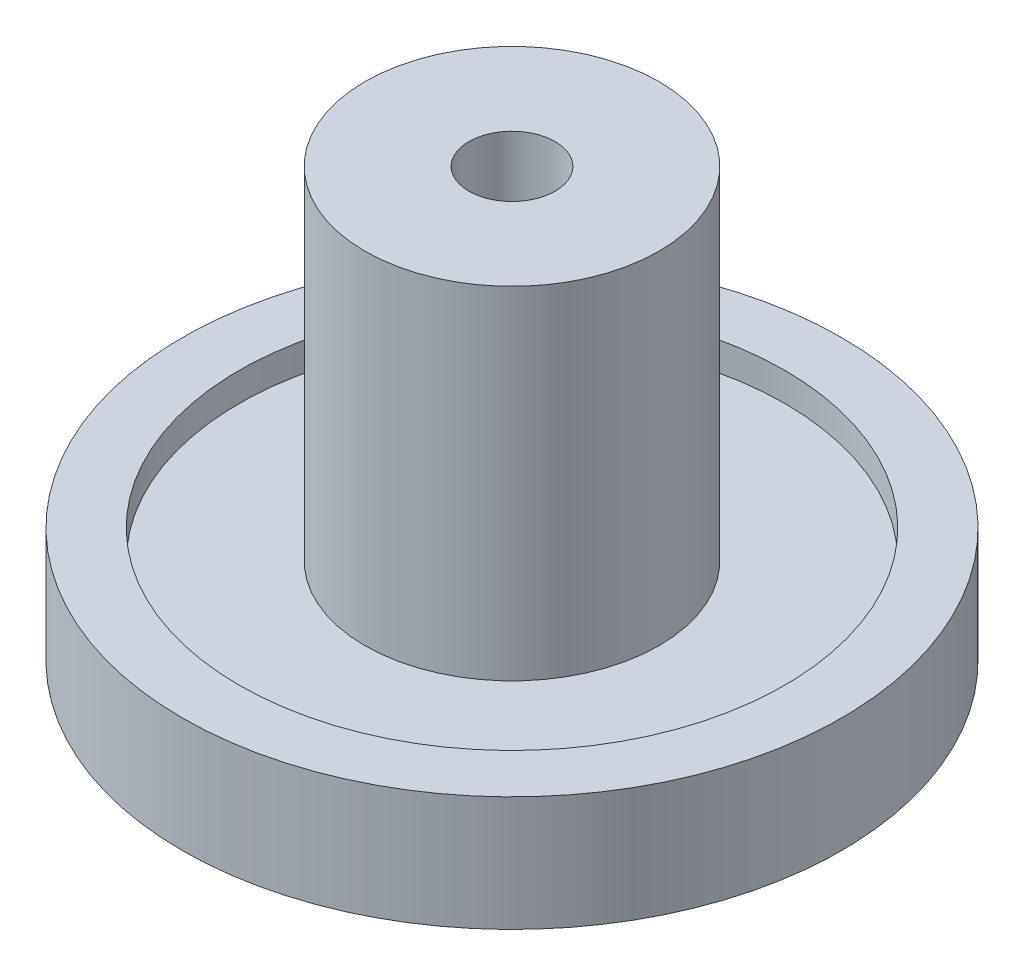
ISO-10303-21;
HEADER;
FILE_DESCRIPTION(('STEP AP214'),'2;1');
FILE_NAME('part.step','',(''),(''),'','','');
FILE_SCHEMA(('AUTOMOTIVE_DESIGN { 1 0 10303 214 1 1 1 1 }'));
ENDSEC;
DATA;
#1=APPLICATION_CONTEXT('core data for automotive mechanical design processes');
#2=APPLICATION_PROTOCOL_DEFINITION('international standard','automotive_design',2000,#1);
#3=PRODUCT_CONTEXT('',#1,'mechanical');
#4=PRODUCT('Part','Part','',(#3));
#5=PRODUCT_RELATED_PRODUCT_CATEGORY('part','',(#4));
#6=PRODUCT_DEFINITION_FORMATION('','',#4);
#7=PRODUCT_DEFINITION_CONTEXT('part definition',#1,'design');
#8=PRODUCT_DEFINITION('design','',#6,#7);
#9=PRODUCT_DEFINITION_SHAPE('','',#8);
#10=(LENGTH_UNIT() NAMED_UNIT(*) SI_UNIT(.MILLI.,.METRE.));
#11=(NAMED_UNIT(*) PLANE_ANGLE_UNIT() SI_UNIT($,.RADIAN.));
#12=(NAMED_UNIT(*) SI_UNIT($,.STERADIAN.) SOLID_ANGLE_UNIT());
#13=UNCERTAINTY_MEASURE_WITH_UNIT(LENGTH_MEASURE(1.E-05),#10,'distance_accuracy_value','');
#14=(GEOMETRIC_REPRESENTATION_CONTEXT(3) GLOBAL_UNCERTAINTY_ASSIGNED_CONTEXT((#13)) GLOBAL_UNIT_ASSIGNED_CONTEXT((#10,
#11,#12)) REPRESENTATION_CONTEXT('',''));
#15=CARTESIAN_POINT('',(0.,0.,0.));
#16=DIRECTION('',(0.,0.,1.));
#17=DIRECTION('',(1.,0.,0.));
#18=AXIS2_PLACEMENT_3D('',#15,#16,#17);
#19=CARTESIAN_POINT('',(5.1181,14.9,0.));
#20=DIRECTION('',(0.,1.,0.));
#21=DIRECTION('',(0.,0.,-1.));
#22=AXIS2_PLACEMENT_3D('',#19,#20,#21);
#23=PLANE('',#22);
#24=CARTESIAN_POINT('',(0.,14.9,0.));
#25=DIRECTION('',(0.,1.,0.));
#26=DIRECTION('',(0.,0.,1.));
#27=AXIS2_PLACEMENT_3D('',#24,#25,#26);
#28=CIRCLE('',#27,1.50000000000001);
#29=CARTESIAN_POINT('',(0.,14.9,1.50000000000001));
#30=VERTEX_POINT('',#29);
#31=EDGE_CURVE('E10',#30,#30,#28,.T.);
#32=ORIENTED_EDGE('',*,*,#31,.F.);
#33=EDGE_LOOP('',(#32));
#34=FACE_BOUND('',#33,.T.);
#35=CARTESIAN_POINT('',(0.,14.9,0.));
#36=DIRECTION('',(0.,1.,0.));
#37=DIRECTION('',(0.,0.,1.));
#38=AXIS2_PLACEMENT_3D('',#35,#36,#37);
#39=CIRCLE('',#38,5.1181);
#40=CARTESIAN_POINT('',(0.,14.9,5.1181));
#41=VERTEX_POINT('',#40);
#42=EDGE_CURVE('E75',#41,#41,#39,.T.);
#43=ORIENTED_EDGE('',*,*,#42,.T.);
#44=EDGE_LOOP('',(#43));
#45=FACE_BOUND('',#44,.T.);
#46=ADVANCED_FACE('F35',(#34,#45),#23,.T.);
#47=CARTESIAN_POINT('',(0.,0.,0.));
#48=DIRECTION('',(0.,-1.,0.));
#49=DIRECTION('',(0.,0.,1.));
#50=AXIS2_PLACEMENT_3D('',#47,#48,#49);
#51=CYLINDRICAL_SURFACE('',#50,1.50000000000001);
#52=CARTESIAN_POINT('',(0.,0.,0.));
#53=DIRECTION('',(0.,1.,0.));
#54=DIRECTION('',(0.,0.,1.));
#55=AXIS2_PLACEMENT_3D('',#52,#53,#54);
#56=CIRCLE('',#55,1.50000000000001);
#57=CARTESIAN_POINT('',(0.,0.,1.50000000000001));
#58=VERTEX_POINT('',#57);
#59=EDGE_CURVE('E41',#58,#58,#56,.T.);
#60=ORIENTED_EDGE('',*,*,#59,.F.);
#61=EDGE_LOOP('',(#60));
#62=FACE_BOUND('',#61,.T.);
#63=ORIENTED_EDGE('',*,*,#31,.T.);
#64=EDGE_LOOP('',(#63));
#65=FACE_BOUND('',#64,.T.);
#66=ADVANCED_FACE('F136',(#62,#65),#51,.F.);
#67=CARTESIAN_POINT('',(1.50000000000001,0.,0.));
#68=DIRECTION('',(0.,-1.,0.));
#69=DIRECTION('',(0.,0.,1.));
#70=AXIS2_PLACEMENT_3D('',#67,#68,#69);
#71=PLANE('',#70);
#72=CARTESIAN_POINT('',(0.,0.,0.));
#73=DIRECTION('',(0.,1.,0.));
#74=DIRECTION('',(0.,0.,1.));
#75=AXIS2_PLACEMENT_3D('',#72,#73,#74);
#76=CIRCLE('',#75,3.5);
#77=CARTESIAN_POINT('',(0.,0.,3.5));
#78=VERTEX_POINT('',#77);
#79=EDGE_CURVE('E45',#78,#78,#76,.T.);
#80=ORIENTED_EDGE('',*,*,#79,.F.);
#81=EDGE_LOOP('',(#80));
#82=FACE_BOUND('',#81,.T.);
#83=ORIENTED_EDGE('',*,*,#59,.T.);
#84=EDGE_LOOP('',(#83));
#85=FACE_BOUND('',#84,.T.);
#86=ADVANCED_FACE('F131',(#82,#85),#71,.T.);
#87=CARTESIAN_POINT('',(0.,0.,0.));
#88=DIRECTION('',(0.,-1.,0.));
#89=DIRECTION('',(0.,0.,1.));
#90=AXIS2_PLACEMENT_3D('',#87,#88,#89);
#91=CYLINDRICAL_SURFACE('',#90,3.5);
#92=CARTESIAN_POINT('',(0.,1.2,0.));
#93=DIRECTION('',(0.,1.,0.));
#94=DIRECTION('',(0.,0.,1.));
#95=AXIS2_PLACEMENT_3D('',#92,#93,#94);
#96=CIRCLE('',#95,3.5);
#97=CARTESIAN_POINT('',(0.,1.2,3.5));
#98=VERTEX_POINT('',#97);
#99=EDGE_CURVE('E49',#98,#98,#96,.T.);
#100=ORIENTED_EDGE('',*,*,#99,.F.);
#101=EDGE_LOOP('',(#100));
#102=FACE_BOUND('',#101,.T.);
#103=ORIENTED_EDGE('',*,*,#79,.T.);
#104=EDGE_LOOP('',(#103));
#105=FACE_BOUND('',#104,.T.);
#106=ADVANCED_FACE('F125',(#102,#105),#91,.T.);
#107=CARTESIAN_POINT('',(3.5,1.2,0.));
#108=DIRECTION('',(0.,-1.,0.));
#109=DIRECTION('',(0.,0.,1.));
#110=AXIS2_PLACEMENT_3D('',#107,#108,#109);
#111=PLANE('',#110);
#112=CARTESIAN_POINT('',(0.,1.2,0.));
#113=DIRECTION('',(0.,1.,0.));
#114=DIRECTION('',(0.,0.,1.));
#115=AXIS2_PLACEMENT_3D('',#112,#113,#114);
#116=CIRCLE('',#115,9.5);
#117=CARTESIAN_POINT('',(0.,1.2,9.5));
#118=VERTEX_POINT('',#117);
#119=EDGE_CURVE('E54',#118,#118,#116,.T.);
#120=ORIENTED_EDGE('',*,*,#119,.F.);
#121=EDGE_LOOP('',(#120));
#122=FACE_BOUND('',#121,.T.);
#123=ORIENTED_EDGE('',*,*,#99,.T.);
#124=EDGE_LOOP('',(#123));
#125=FACE_BOUND('',#124,.T.);
#126=ADVANCED_FACE('F119',(#122,#125),#111,.T.);
#127=CARTESIAN_POINT('',(0.,0.,0.));
#128=DIRECTION('',(0.,-1.,0.));
#129=DIRECTION('',(0.,0.,1.));
#130=AXIS2_PLACEMENT_3D('',#127,#128,#129);
#131=CYLINDRICAL_SURFACE('',#130,9.5);
#132=CARTESIAN_POINT('',(0.,0.,0.));
#133=DIRECTION('',(0.,1.,0.));
#134=DIRECTION('',(0.,0.,1.));
#135=AXIS2_PLACEMENT_3D('',#132,#133,#134);
#136=CIRCLE('',#135,9.5);
#137=CARTESIAN_POINT('',(0.,0.,9.5));
#138=VERTEX_POINT('',#137);
#139=EDGE_CURVE('E57',#138,#138,#136,.T.);
#140=ORIENTED_EDGE('',*,*,#139,.F.);
#141=EDGE_LOOP('',(#140));
#142=FACE_BOUND('',#141,.T.);
#143=ORIENTED_EDGE('',*,*,#119,.T.);
#144=EDGE_LOOP('',(#143));
#145=FACE_BOUND('',#144,.T.);
#146=ADVANCED_FACE('F113',(#142,#145),#131,.F.);
#147=CARTESIAN_POINT('',(9.5,0.,0.));
#148=DIRECTION('',(0.,-1.,0.));
#149=DIRECTION('',(0.,0.,1.));
#150=AXIS2_PLACEMENT_3D('',#147,#148,#149);
#151=PLANE('',#150);
#152=CARTESIAN_POINT('',(0.,0.,0.));
#153=DIRECTION('',(0.,1.,0.));
#154=DIRECTION('',(0.,0.,1.));
#155=AXIS2_PLACEMENT_3D('',#152,#153,#154);
#156=CIRCLE('',#155,11.477625);
#157=CARTESIAN_POINT('',(0.,0.,11.477625));
#158=VERTEX_POINT('',#157);
#159=EDGE_CURVE('E60',#158,#158,#156,.T.);
#160=ORIENTED_EDGE('',*,*,#159,.F.);
#161=EDGE_LOOP('',(#160));
#162=FACE_BOUND('',#161,.T.);
#163=ORIENTED_EDGE('',*,*,#139,.T.);
#164=EDGE_LOOP('',(#163));
#165=FACE_BOUND('',#164,.T.);
#166=ADVANCED_FACE('F107',(#162,#165),#151,.T.);
#167=CARTESIAN_POINT('',(0.,0.,0.));
#168=DIRECTION('',(0.,-1.,0.));
#169=DIRECTION('',(0.,0.,1.));
#170=AXIS2_PLACEMENT_3D('',#167,#168,#169);
#171=CYLINDRICAL_SURFACE('',#170,11.477625);
#172=CARTESIAN_POINT('',(0.,4.,0.));
#173=DIRECTION('',(0.,1.,0.));
#174=DIRECTION('',(0.,0.,1.));
#175=AXIS2_PLACEMENT_3D('',#172,#173,#174);
#176=CIRCLE('',#175,11.477625);
#177=CARTESIAN_POINT('',(0.,4.,11.477625));
#178=VERTEX_POINT('',#177);
#179=EDGE_CURVE('E63',#178,#178,#176,.T.);
#180=ORIENTED_EDGE('',*,*,#179,.F.);
#181=EDGE_LOOP('',(#180));
#182=FACE_BOUND('',#181,.T.);
#183=ORIENTED_EDGE('',*,*,#159,.T.);
#184=EDGE_LOOP('',(#183));
#185=FACE_BOUND('',#184,.T.);
#186=ADVANCED_FACE('F101',(#182,#185),#171,.T.);
#187=CARTESIAN_POINT('',(11.477625,4.,0.));
#188=DIRECTION('',(0.,1.,0.));
#189=DIRECTION('',(0.,0.,-1.));
#190=AXIS2_PLACEMENT_3D('',#187,#188,#189);
#191=PLANE('',#190);
#192=CARTESIAN_POINT('',(0.,4.,0.));
#193=DIRECTION('',(0.,1.,0.));
#194=DIRECTION('',(0.,0.,1.));
#195=AXIS2_PLACEMENT_3D('',#192,#193,#194);
#196=CIRCLE('',#195,9.5);
#197=CARTESIAN_POINT('',(0.,4.,9.5));
#198=VERTEX_POINT('',#197);
#199=EDGE_CURVE('E66',#198,#198,#196,.T.);
#200=ORIENTED_EDGE('',*,*,#199,.F.);
#201=EDGE_LOOP('',(#200));
#202=FACE_BOUND('',#201,.T.);
#203=ORIENTED_EDGE('',*,*,#179,.T.);
#204=EDGE_LOOP('',(#203));
#205=FACE_BOUND('',#204,.T.);
#206=ADVANCED_FACE('F95',(#202,#205),#191,.T.);
#207=CARTESIAN_POINT('',(0.,0.,0.));
#208=DIRECTION('',(0.,-1.,0.));
#209=DIRECTION('',(0.,0.,1.));
#210=AXIS2_PLACEMENT_3D('',#207,#208,#209);
#211=CYLINDRICAL_SURFACE('',#210,9.5);
#212=CARTESIAN_POINT('',(0.,3.,0.));
#213=DIRECTION('',(0.,1.,0.));
#214=DIRECTION('',(0.,0.,1.));
#215=AXIS2_PLACEMENT_3D('',#212,#213,#214);
#216=CIRCLE('',#215,9.5);
#217=CARTESIAN_POINT('',(0.,3.,9.5));
#218=VERTEX_POINT('',#217);
#219=EDGE_CURVE('E69',#218,#218,#216,.T.);
#220=ORIENTED_EDGE('',*,*,#219,.F.);
#221=EDGE_LOOP('',(#220));
#222=FACE_BOUND('',#221,.T.);
#223=ORIENTED_EDGE('',*,*,#199,.T.);
#224=EDGE_LOOP('',(#223));
#225=FACE_BOUND('',#224,.T.);
#226=ADVANCED_FACE('F89',(#222,#225),#211,.F.);
#227=CARTESIAN_POINT('',(9.5,3.,0.));
#228=DIRECTION('',(0.,1.,0.));
#229=DIRECTION('',(0.,0.,-1.));
#230=AXIS2_PLACEMENT_3D('',#227,#228,#229);
#231=PLANE('',#230);
#232=CARTESIAN_POINT('',(0.,3.,0.));
#233=DIRECTION('',(0.,1.,0.));
#234=DIRECTION('',(0.,0.,1.));
#235=AXIS2_PLACEMENT_3D('',#232,#233,#234);
#236=CIRCLE('',#235,5.1181);
#237=CARTESIAN_POINT('',(0.,3.,5.1181));
#238=VERTEX_POINT('',#237);
#239=EDGE_CURVE('E72',#238,#238,#236,.T.);
#240=ORIENTED_EDGE('',*,*,#239,.F.);
#241=EDGE_LOOP('',(#240));
#242=FACE_BOUND('',#241,.T.);
#243=ORIENTED_EDGE('',*,*,#219,.T.);
#244=EDGE_LOOP('',(#243));
#245=FACE_BOUND('',#244,.T.);
#246=ADVANCED_FACE('F83',(#242,#245),#231,.T.);
#247=CARTESIAN_POINT('',(0.,0.,0.));
#248=DIRECTION('',(0.,-1.,0.));
#249=DIRECTION('',(0.,0.,1.));
#250=AXIS2_PLACEMENT_3D('',#247,#248,#249);
#251=CYLINDRICAL_SURFACE('',#250,5.1181);
#252=ORIENTED_EDGE('',*,*,#42,.F.);
#253=EDGE_LOOP('',(#252));
#254=FACE_BOUND('',#253,.T.);
#255=ORIENTED_EDGE('',*,*,#239,.T.);
#256=EDGE_LOOP('',(#255));
#257=FACE_BOUND('',#256,.T.);
#258=ADVANCED_FACE('F80',(#254,#257),#251,.T.);
#259=CLOSED_SHELL('',(#46,#66,#86,#106,#126,#146,#166,#186,#206,#226,#246,#258));
#260=MANIFOLD_SOLID_BREP('B2',#259);
#261=ADVANCED_BREP_SHAPE_REPRESENTATION('',(#18,#260),#14);
#262=SHAPE_DEFINITION_REPRESENTATION(#9,#261);
ENDSEC;
END-ISO-10303-21;
